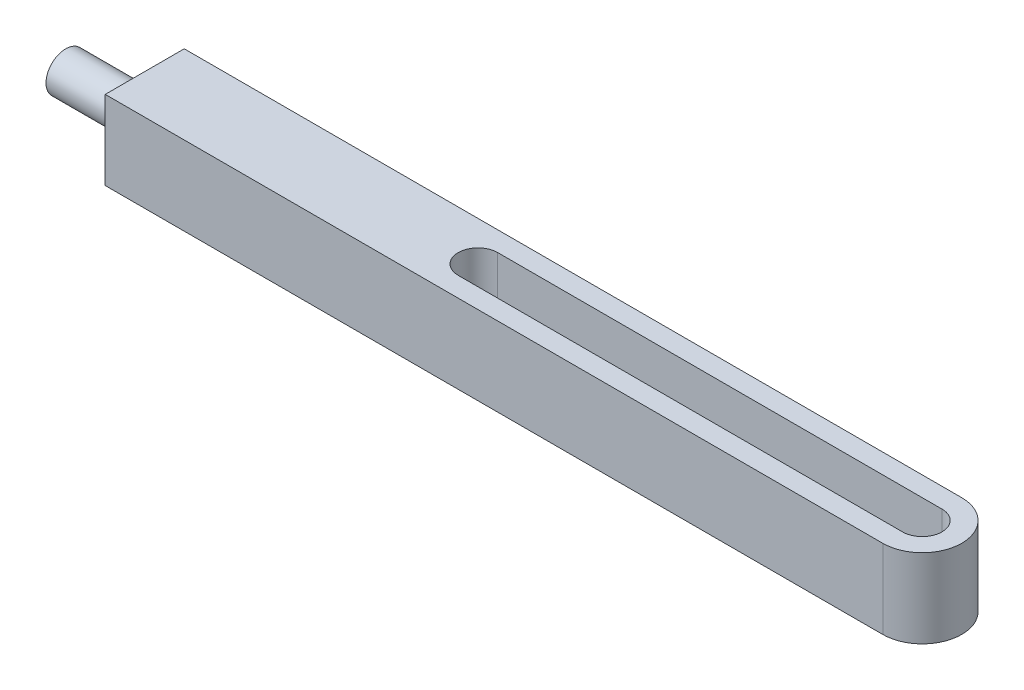
ISO-10303-21;
HEADER;
FILE_DESCRIPTION(('STEP AP214'),'2;1');
FILE_NAME('part.step','',(''),(''),'','','');
FILE_SCHEMA(('AUTOMOTIVE_DESIGN { 1 0 10303 214 1 1 1 1 }'));
ENDSEC;
DATA;
#1=APPLICATION_CONTEXT('core data for automotive mechanical design processes');
#2=APPLICATION_PROTOCOL_DEFINITION('international standard','automotive_design',2000,#1);
#3=PRODUCT_CONTEXT('',#1,'mechanical');
#4=PRODUCT('Part','Part','',(#3));
#5=PRODUCT_RELATED_PRODUCT_CATEGORY('part','',(#4));
#6=PRODUCT_DEFINITION_FORMATION('','',#4);
#7=PRODUCT_DEFINITION_CONTEXT('part definition',#1,'design');
#8=PRODUCT_DEFINITION('design','',#6,#7);
#9=PRODUCT_DEFINITION_SHAPE('','',#8);
#10=(LENGTH_UNIT() NAMED_UNIT(*) SI_UNIT(.MILLI.,.METRE.));
#11=(NAMED_UNIT(*) PLANE_ANGLE_UNIT() SI_UNIT($,.RADIAN.));
#12=(NAMED_UNIT(*) SI_UNIT($,.STERADIAN.) SOLID_ANGLE_UNIT());
#13=UNCERTAINTY_MEASURE_WITH_UNIT(LENGTH_MEASURE(1.E-05),#10,'distance_accuracy_value','');
#14=(GEOMETRIC_REPRESENTATION_CONTEXT(3) GLOBAL_UNCERTAINTY_ASSIGNED_CONTEXT((#13)) GLOBAL_UNIT_ASSIGNED_CONTEXT((#10,
#11,#12)) REPRESENTATION_CONTEXT('',''));
#15=CARTESIAN_POINT('',(0.,0.,0.));
#16=DIRECTION('',(0.,0.,1.));
#17=DIRECTION('',(1.,0.,0.));
#18=AXIS2_PLACEMENT_3D('',#15,#16,#17);
#19=CARTESIAN_POINT('',(0.,-205.865206441962,22.9730881922548));
#20=DIRECTION('',(0.,0.,1.));
#21=DIRECTION('',(1.,0.,0.));
#22=AXIS2_PLACEMENT_3D('',#19,#20,#21);
#23=PLANE('',#22);
#24=DIRECTION('',(-1.,0.,0.));
#25=VECTOR('',#24,1.);
#26=CARTESIAN_POINT('',(0.,-122.731696712451,22.9730881922548));
#27=LINE('',#26,#25);
#28=CARTESIAN_POINT('',(82.7476914478386,-122.731696712451,22.9730881922549));
#29=VERTEX_POINT('',#28);
#30=CARTESIAN_POINT('',(37.7476914478386,-122.731696712451,22.9730881922549));
#31=VERTEX_POINT('',#30);
#32=EDGE_CURVE('E46',#29,#31,#27,.T.);
#33=ORIENTED_EDGE('',*,*,#32,.F.);
#34=DIRECTION('',(0.,1.,0.));
#35=VECTOR('',#34,1.);
#36=CARTESIAN_POINT('',(82.7476914478386,-205.865206441962,22.9730881922549));
#37=LINE('',#36,#35);
#38=CARTESIAN_POINT('',(82.7476914478386,-114.731696712451,22.9730881922549));
#39=VERTEX_POINT('',#38);
#40=EDGE_CURVE('E155',#29,#39,#37,.T.);
#41=ORIENTED_EDGE('',*,*,#40,.T.);
#42=DIRECTION('',(1.,0.,0.));
#43=VECTOR('',#42,1.);
#44=CARTESIAN_POINT('',(0.,-114.731696712451,22.9730881922548));
#45=LINE('',#44,#43);
#46=CARTESIAN_POINT('',(37.7476914478386,-114.731696712451,22.9730881922549));
#47=VERTEX_POINT('',#46);
#48=EDGE_CURVE('E133',#47,#39,#45,.T.);
#49=ORIENTED_EDGE('',*,*,#48,.F.);
#50=DIRECTION('',(0.,1.,0.));
#51=VECTOR('',#50,1.);
#52=CARTESIAN_POINT('',(37.7476914478386,-205.865206441962,22.9730881922549));
#53=LINE('',#52,#51);
#54=EDGE_CURVE('E123',#31,#47,#53,.T.);
#55=ORIENTED_EDGE('',*,*,#54,.F.);
#56=EDGE_LOOP('',(#33,#41,#49,#55));
#57=FACE_BOUND('',#56,.T.);
#58=ADVANCED_FACE('F37',(#57),#23,.T.);
#59=CARTESIAN_POINT('',(82.7476914478386,-205.865206441962,24.9730881922549));
#60=DIRECTION('',(0.,1.,0.));
#61=DIRECTION('',(0.,0.,1.));
#62=AXIS2_PLACEMENT_3D('',#59,#60,#61);
#63=CYLINDRICAL_SURFACE('',#62,2.);
#64=CARTESIAN_POINT('',(82.7476914478386,-122.731696712451,24.9730881922549));
#65=DIRECTION('',(0.,1.,0.));
#66=DIRECTION('',(0.,0.,1.));
#67=AXIS2_PLACEMENT_3D('',#64,#65,#66);
#68=CIRCLE('',#67,2.);
#69=CARTESIAN_POINT('',(82.7476914478386,-122.731696712451,26.9730881922549));
#70=VERTEX_POINT('',#69);
#71=EDGE_CURVE('E160',#70,#29,#68,.T.);
#72=ORIENTED_EDGE('',*,*,#71,.F.);
#73=DIRECTION('',(0.,1.,0.));
#74=VECTOR('',#73,1.);
#75=CARTESIAN_POINT('',(82.7476914478386,-205.865206441962,26.9730881922549));
#76=LINE('',#75,#74);
#77=CARTESIAN_POINT('',(82.7476914478386,-114.731696712451,26.9730881922549));
#78=VERTEX_POINT('',#77);
#79=EDGE_CURVE('E111',#70,#78,#76,.T.);
#80=ORIENTED_EDGE('',*,*,#79,.T.);
#81=CARTESIAN_POINT('',(82.7476914478386,-114.731696712451,24.9730881922549));
#82=DIRECTION('',(0.,-1.,0.));
#83=DIRECTION('',(0.,0.,-1.));
#84=AXIS2_PLACEMENT_3D('',#81,#82,#83);
#85=CIRCLE('',#84,2.);
#86=EDGE_CURVE('E120',#39,#78,#85,.T.);
#87=ORIENTED_EDGE('',*,*,#86,.F.);
#88=ORIENTED_EDGE('',*,*,#40,.F.);
#89=EDGE_LOOP('',(#72,#80,#87,#88));
#90=FACE_BOUND('',#89,.T.);
#91=ADVANCED_FACE('F158',(#90),#63,.F.);
#92=CARTESIAN_POINT('',(0.,-205.865206441962,26.9730881922548));
#93=DIRECTION('',(0.,0.,1.));
#94=DIRECTION('',(1.,0.,0.));
#95=AXIS2_PLACEMENT_3D('',#92,#93,#94);
#96=PLANE('',#95);
#97=ORIENTED_EDGE('',*,*,#79,.F.);
#98=DIRECTION('',(-1.,0.,0.));
#99=VECTOR('',#98,1.);
#100=CARTESIAN_POINT('',(0.,-122.731696712451,26.9730881922548));
#101=LINE('',#100,#99);
#102=CARTESIAN_POINT('',(37.7476914478386,-122.731696712451,26.9730881922549));
#103=VERTEX_POINT('',#102);
#104=EDGE_CURVE('E54',#70,#103,#101,.T.);
#105=ORIENTED_EDGE('',*,*,#104,.T.);
#106=DIRECTION('',(0.,1.,0.));
#107=VECTOR('',#106,1.);
#108=CARTESIAN_POINT('',(37.7476914478386,-205.865206441962,26.9730881922549));
#109=LINE('',#108,#107);
#110=CARTESIAN_POINT('',(37.7476914478386,-114.731696712451,26.9730881922549));
#111=VERTEX_POINT('',#110);
#112=EDGE_CURVE('E102',#103,#111,#109,.T.);
#113=ORIENTED_EDGE('',*,*,#112,.T.);
#114=DIRECTION('',(1.,0.,0.));
#115=VECTOR('',#114,1.);
#116=CARTESIAN_POINT('',(0.,-114.731696712451,26.9730881922548));
#117=LINE('',#116,#115);
#118=EDGE_CURVE('E106',#111,#78,#117,.T.);
#119=ORIENTED_EDGE('',*,*,#118,.T.);
#120=EDGE_LOOP('',(#97,#105,#113,#119));
#121=FACE_BOUND('',#120,.T.);
#122=ADVANCED_FACE('F105',(#121),#96,.F.);
#123=CARTESIAN_POINT('',(37.7476914478386,-205.865206441962,24.9730881922549));
#124=DIRECTION('',(0.,1.,0.));
#125=DIRECTION('',(0.,0.,1.));
#126=AXIS2_PLACEMENT_3D('',#123,#124,#125);
#127=CYLINDRICAL_SURFACE('',#126,2.);
#128=ORIENTED_EDGE('',*,*,#112,.F.);
#129=CARTESIAN_POINT('',(37.7476914478386,-122.731696712451,24.9730881922549));
#130=DIRECTION('',(0.,1.,0.));
#131=DIRECTION('',(0.,0.,1.));
#132=AXIS2_PLACEMENT_3D('',#129,#130,#131);
#133=CIRCLE('',#132,2.);
#134=EDGE_CURVE('E129',#103,#31,#133,.F.);
#135=ORIENTED_EDGE('',*,*,#134,.T.);
#136=ORIENTED_EDGE('',*,*,#54,.T.);
#137=CARTESIAN_POINT('',(37.7476914478386,-114.731696712451,24.9730881922549));
#138=DIRECTION('',(0.,-1.,0.));
#139=DIRECTION('',(0.,0.,-1.));
#140=AXIS2_PLACEMENT_3D('',#137,#138,#139);
#141=CIRCLE('',#140,2.);
#142=EDGE_CURVE('E117',#47,#111,#141,.F.);
#143=ORIENTED_EDGE('',*,*,#142,.T.);
#144=EDGE_LOOP('',(#128,#135,#136,#143));
#145=FACE_BOUND('',#144,.T.);
#146=ADVANCED_FACE('F39',(#145),#127,.F.);
#147=CARTESIAN_POINT('',(0.,-114.731696712451,0.));
#148=DIRECTION('',(0.,-1.,0.));
#149=DIRECTION('',(0.,0.,-1.));
#150=AXIS2_PLACEMENT_3D('',#147,#148,#149);
#151=PLANE('',#150);
#152=ORIENTED_EDGE('',*,*,#142,.F.);
#153=ORIENTED_EDGE('',*,*,#48,.T.);
#154=ORIENTED_EDGE('',*,*,#86,.T.);
#155=ORIENTED_EDGE('',*,*,#118,.F.);
#156=EDGE_LOOP('',(#152,#153,#154,#155));
#157=FACE_BOUND('',#156,.T.);
#158=DIRECTION('',(-1.,0.,0.));
#159=VECTOR('',#158,1.);
#160=CARTESIAN_POINT('',(0.,-114.731696712451,20.9730881922549));
#161=LINE('',#160,#159);
#162=CARTESIAN_POINT('',(82.7476914478386,-114.731696712451,20.9730881922549));
#163=VERTEX_POINT('',#162);
#164=CARTESIAN_POINT('',(4.,-114.731696712451,20.9730881922549));
#165=VERTEX_POINT('',#164);
#166=EDGE_CURVE('E135',#163,#165,#161,.T.);
#167=ORIENTED_EDGE('',*,*,#166,.T.);
#168=DIRECTION('',(0.,0.,-1.));
#169=VECTOR('',#168,1.);
#170=CARTESIAN_POINT('',(4.00000000000001,-114.731696712451,0.));
#171=LINE('',#170,#169);
#172=CARTESIAN_POINT('',(4.,-114.731696712451,28.9730881922549));
#173=VERTEX_POINT('',#172);
#174=EDGE_CURVE('E144',#173,#165,#171,.T.);
#175=ORIENTED_EDGE('',*,*,#174,.F.);
#176=DIRECTION('',(-1.,0.,0.));
#177=VECTOR('',#176,1.);
#178=CARTESIAN_POINT('',(0.,-114.731696712451,28.9730881922549));
#179=LINE('',#178,#177);
#180=CARTESIAN_POINT('',(82.7476914478386,-114.731696712451,28.9730881922549));
#181=VERTEX_POINT('',#180);
#182=EDGE_CURVE('E141',#181,#173,#179,.T.);
#183=ORIENTED_EDGE('',*,*,#182,.F.);
#184=CARTESIAN_POINT('',(82.7476914478386,-114.731696712451,24.9730881922549));
#185=DIRECTION('',(0.,-1.,0.));
#186=DIRECTION('',(0.,0.,-1.));
#187=AXIS2_PLACEMENT_3D('',#184,#185,#186);
#188=CIRCLE('',#187,4.);
#189=EDGE_CURVE('E138',#181,#163,#188,.F.);
#190=ORIENTED_EDGE('',*,*,#189,.T.);
#191=EDGE_LOOP('',(#167,#175,#183,#190));
#192=FACE_BOUND('',#191,.T.);
#193=ADVANCED_FACE('F114',(#157,#192),#151,.F.);
#194=CARTESIAN_POINT('',(4.00000000000001,-205.865206441962,0.));
#195=DIRECTION('',(1.,0.,0.));
#196=DIRECTION('',(0.,0.,-1.));
#197=AXIS2_PLACEMENT_3D('',#194,#195,#196);
#198=PLANE('',#197);
#199=CARTESIAN_POINT('',(4.,-118.731696712451,24.973088192255));
#200=DIRECTION('',(-1.,0.,0.));
#201=DIRECTION('',(0.,0.,1.));
#202=AXIS2_PLACEMENT_3D('',#199,#200,#201);
#203=CIRCLE('',#202,2.);
#204=CARTESIAN_POINT('',(4.,-118.731696712451,26.973088192255));
#205=VERTEX_POINT('',#204);
#206=EDGE_CURVE('E11',#205,#205,#203,.T.);
#207=ORIENTED_EDGE('',*,*,#206,.F.);
#208=EDGE_LOOP('',(#207));
#209=FACE_BOUND('',#208,.T.);
#210=DIRECTION('',(0.,1.,0.));
#211=VECTOR('',#210,1.);
#212=CARTESIAN_POINT('',(4.,-205.865206441962,20.9730881922549));
#213=LINE('',#212,#211);
#214=CARTESIAN_POINT('',(4.,-122.731696712451,20.9730881922549));
#215=VERTEX_POINT('',#214);
#216=EDGE_CURVE('E110',#215,#165,#213,.T.);
#217=ORIENTED_EDGE('',*,*,#216,.F.);
#218=DIRECTION('',(0.,0.,1.));
#219=VECTOR('',#218,1.);
#220=CARTESIAN_POINT('',(4.00000000000001,-122.731696712451,0.));
#221=LINE('',#220,#219);
#222=CARTESIAN_POINT('',(4.,-122.731696712451,28.9730881922549));
#223=VERTEX_POINT('',#222);
#224=EDGE_CURVE('E41',#215,#223,#221,.T.);
#225=ORIENTED_EDGE('',*,*,#224,.T.);
#226=DIRECTION('',(0.,1.,0.));
#227=VECTOR('',#226,1.);
#228=CARTESIAN_POINT('',(4.,-205.865206441962,28.9730881922549));
#229=LINE('',#228,#227);
#230=EDGE_CURVE('E148',#223,#173,#229,.T.);
#231=ORIENTED_EDGE('',*,*,#230,.T.);
#232=ORIENTED_EDGE('',*,*,#174,.T.);
#233=EDGE_LOOP('',(#217,#225,#231,#232));
#234=FACE_BOUND('',#233,.T.);
#235=ADVANCED_FACE('F190',(#209,#234),#198,.F.);
#236=CARTESIAN_POINT('',(0.,-205.865206441962,28.9730881922549));
#237=DIRECTION('',(0.,0.,-1.));
#238=DIRECTION('',(-1.,0.,0.));
#239=AXIS2_PLACEMENT_3D('',#236,#237,#238);
#240=PLANE('',#239);
#241=ORIENTED_EDGE('',*,*,#230,.F.);
#242=DIRECTION('',(1.,0.,0.));
#243=VECTOR('',#242,1.);
#244=CARTESIAN_POINT('',(0.,-122.731696712451,28.9730881922549));
#245=LINE('',#244,#243);
#246=CARTESIAN_POINT('',(82.7476914478386,-122.731696712451,28.9730881922549));
#247=VERTEX_POINT('',#246);
#248=EDGE_CURVE('E169',#223,#247,#245,.T.);
#249=ORIENTED_EDGE('',*,*,#248,.T.);
#250=DIRECTION('',(0.,1.,0.));
#251=VECTOR('',#250,1.);
#252=CARTESIAN_POINT('',(82.7476914478386,-205.865206441962,28.9730881922549));
#253=LINE('',#252,#251);
#254=EDGE_CURVE('E150',#247,#181,#253,.T.);
#255=ORIENTED_EDGE('',*,*,#254,.T.);
#256=ORIENTED_EDGE('',*,*,#182,.T.);
#257=EDGE_LOOP('',(#241,#249,#255,#256));
#258=FACE_BOUND('',#257,.T.);
#259=ADVANCED_FACE('F195',(#258),#240,.F.);
#260=CARTESIAN_POINT('',(82.7476914478386,-205.865206441962,24.9730881922549));
#261=DIRECTION('',(0.,1.,0.));
#262=DIRECTION('',(0.,0.,1.));
#263=AXIS2_PLACEMENT_3D('',#260,#261,#262);
#264=CYLINDRICAL_SURFACE('',#263,4.);
#265=CARTESIAN_POINT('',(82.7476914478386,-122.731696712451,24.9730881922549));
#266=DIRECTION('',(0.,1.,0.));
#267=DIRECTION('',(0.,0.,1.));
#268=AXIS2_PLACEMENT_3D('',#265,#266,#267);
#269=CIRCLE('',#268,4.);
#270=CARTESIAN_POINT('',(82.7476914478386,-122.731696712451,20.9730881922549));
#271=VERTEX_POINT('',#270);
#272=EDGE_CURVE('E167',#271,#247,#269,.F.);
#273=ORIENTED_EDGE('',*,*,#272,.F.);
#274=DIRECTION('',(0.,1.,0.));
#275=VECTOR('',#274,1.);
#276=CARTESIAN_POINT('',(82.7476914478386,-205.865206441962,20.9730881922549));
#277=LINE('',#276,#275);
#278=EDGE_CURVE('E152',#271,#163,#277,.T.);
#279=ORIENTED_EDGE('',*,*,#278,.T.);
#280=ORIENTED_EDGE('',*,*,#189,.F.);
#281=ORIENTED_EDGE('',*,*,#254,.F.);
#282=EDGE_LOOP('',(#273,#279,#280,#281));
#283=FACE_BOUND('',#282,.T.);
#284=ADVANCED_FACE('F203',(#283),#264,.T.);
#285=CARTESIAN_POINT('',(0.,-205.865206441962,20.9730881922549));
#286=DIRECTION('',(0.,0.,-1.));
#287=DIRECTION('',(-1.,0.,0.));
#288=AXIS2_PLACEMENT_3D('',#285,#286,#287);
#289=PLANE('',#288);
#290=DIRECTION('',(1.,0.,0.));
#291=VECTOR('',#290,1.);
#292=CARTESIAN_POINT('',(0.,-122.731696712451,20.9730881922549));
#293=LINE('',#292,#291);
#294=EDGE_CURVE('E165',#215,#271,#293,.T.);
#295=ORIENTED_EDGE('',*,*,#294,.F.);
#296=ORIENTED_EDGE('',*,*,#216,.T.);
#297=ORIENTED_EDGE('',*,*,#166,.F.);
#298=ORIENTED_EDGE('',*,*,#278,.F.);
#299=EDGE_LOOP('',(#295,#296,#297,#298));
#300=FACE_BOUND('',#299,.T.);
#301=ADVANCED_FACE('F181',(#300),#289,.T.);
#302=CARTESIAN_POINT('',(177.747691447839,-122.731696712451,24.9730881922548));
#303=DIRECTION('',(0.,1.,0.));
#304=DIRECTION('',(0.,0.,1.));
#305=AXIS2_PLACEMENT_3D('',#302,#303,#304);
#306=PLANE('',#305);
#307=ORIENTED_EDGE('',*,*,#294,.T.);
#308=ORIENTED_EDGE('',*,*,#272,.T.);
#309=ORIENTED_EDGE('',*,*,#248,.F.);
#310=ORIENTED_EDGE('',*,*,#224,.F.);
#311=EDGE_LOOP('',(#307,#308,#309,#310));
#312=FACE_BOUND('',#311,.T.);
#313=ORIENTED_EDGE('',*,*,#104,.F.);
#314=ORIENTED_EDGE('',*,*,#71,.T.);
#315=ORIENTED_EDGE('',*,*,#32,.T.);
#316=ORIENTED_EDGE('',*,*,#134,.F.);
#317=EDGE_LOOP('',(#313,#314,#315,#316));
#318=FACE_BOUND('',#317,.T.);
#319=ADVANCED_FACE('F199',(#312,#318),#306,.F.);
#320=CARTESIAN_POINT('',(-4.,-118.731696712451,24.973088192255));
#321=DIRECTION('',(1.,0.,0.));
#322=DIRECTION('',(0.,0.,-1.));
#323=AXIS2_PLACEMENT_3D('',#320,#321,#322);
#324=CYLINDRICAL_SURFACE('',#323,2.);
#325=CARTESIAN_POINT('',(-4.,-118.731696712451,24.973088192255));
#326=DIRECTION('',(-1.,0.,0.));
#327=DIRECTION('',(0.,0.,1.));
#328=AXIS2_PLACEMENT_3D('',#325,#326,#327);
#329=CIRCLE('',#328,2.);
#330=CARTESIAN_POINT('',(-4.,-118.731696712451,26.973088192255));
#331=VERTEX_POINT('',#330);
#332=EDGE_CURVE('E124',#331,#331,#329,.T.);
#333=ORIENTED_EDGE('',*,*,#332,.F.);
#334=EDGE_LOOP('',(#333));
#335=FACE_BOUND('',#334,.T.);
#336=ORIENTED_EDGE('',*,*,#206,.T.);
#337=EDGE_LOOP('',(#336));
#338=FACE_BOUND('',#337,.T.);
#339=ADVANCED_FACE('F222',(#335,#338),#324,.T.);
#340=CARTESIAN_POINT('',(-4.,-118.731696712451,24.973088192255));
#341=DIRECTION('',(-1.,0.,0.));
#342=DIRECTION('',(0.,0.,1.));
#343=AXIS2_PLACEMENT_3D('',#340,#341,#342);
#344=PLANE('',#343);
#345=ORIENTED_EDGE('',*,*,#332,.T.);
#346=EDGE_LOOP('',(#345));
#347=FACE_BOUND('',#346,.T.);
#348=ADVANCED_FACE('F226',(#347),#344,.T.);
#349=CLOSED_SHELL('',(#58,#91,#122,#146,#193,#235,#259,#284,#301,#319,#339,#348));
#350=MANIFOLD_SOLID_BREP('B2',#349);
#351=ADVANCED_BREP_SHAPE_REPRESENTATION('',(#18,#350),#14);
#352=SHAPE_DEFINITION_REPRESENTATION(#9,#351);
ENDSEC;
END-ISO-10303-21;
